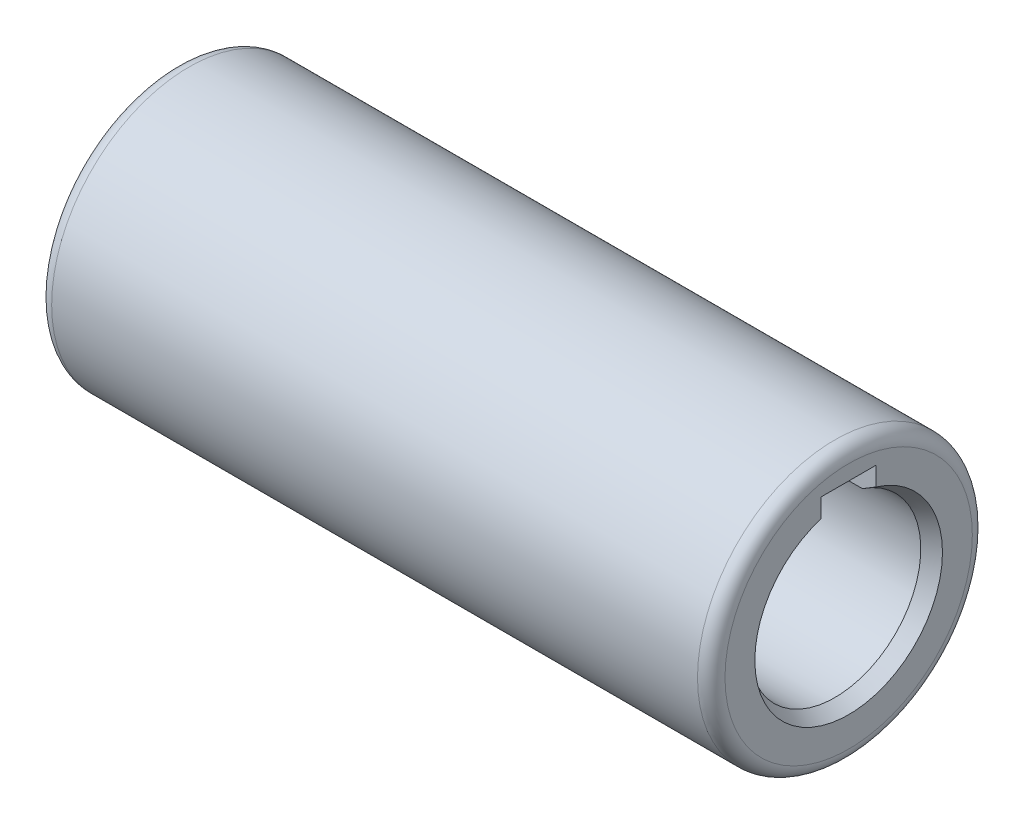
ISO-10303-21;
HEADER;
FILE_DESCRIPTION(('STEP AP214'),'2;1');
FILE_NAME('part.step','',(''),(''),'','','');
FILE_SCHEMA(('AUTOMOTIVE_DESIGN { 1 0 10303 214 1 1 1 1 }'));
ENDSEC;
DATA;
#1=APPLICATION_CONTEXT('core data for automotive mechanical design processes');
#2=APPLICATION_PROTOCOL_DEFINITION('international standard','automotive_design',2000,#1);
#3=PRODUCT_CONTEXT('',#1,'mechanical');
#4=PRODUCT('Part','Part','',(#3));
#5=PRODUCT_RELATED_PRODUCT_CATEGORY('part','',(#4));
#6=PRODUCT_DEFINITION_FORMATION('','',#4);
#7=PRODUCT_DEFINITION_CONTEXT('part definition',#1,'design');
#8=PRODUCT_DEFINITION('design','',#6,#7);
#9=PRODUCT_DEFINITION_SHAPE('','',#8);
#10=(LENGTH_UNIT() NAMED_UNIT(*) SI_UNIT(.MILLI.,.METRE.));
#11=(NAMED_UNIT(*) PLANE_ANGLE_UNIT() SI_UNIT($,.RADIAN.));
#12=(NAMED_UNIT(*) SI_UNIT($,.STERADIAN.) SOLID_ANGLE_UNIT());
#13=UNCERTAINTY_MEASURE_WITH_UNIT(LENGTH_MEASURE(1.E-05),#10,'distance_accuracy_value','');
#14=(GEOMETRIC_REPRESENTATION_CONTEXT(3) GLOBAL_UNCERTAINTY_ASSIGNED_CONTEXT((#13)) GLOBAL_UNIT_ASSIGNED_CONTEXT((#10,
#11,#12)) REPRESENTATION_CONTEXT('',''));
#15=CARTESIAN_POINT('',(0.,0.,0.));
#16=DIRECTION('',(0.,0.,1.));
#17=DIRECTION('',(1.,0.,0.));
#18=AXIS2_PLACEMENT_3D('',#15,#16,#17);
#19=CARTESIAN_POINT('',(-49.,0.,0.));
#20=DIRECTION('',(-1.,0.,0.));
#21=DIRECTION('',(0.,0.,1.));
#22=AXIS2_PLACEMENT_3D('',#19,#20,#21);
#23=CYLINDRICAL_SURFACE('',#22,12.5);
#24=CARTESIAN_POINT('',(15.,0.,0.));
#25=DIRECTION('',(-1.,0.,0.));
#26=DIRECTION('',(0.,0.,1.));
#27=AXIS2_PLACEMENT_3D('',#24,#25,#26);
#28=CIRCLE('',#27,12.5);
#29=CARTESIAN_POINT('',(15.,11.842719282327,-4.));
#30=VERTEX_POINT('',#29);
#31=CARTESIAN_POINT('',(15.,11.842719282327,4.));
#32=VERTEX_POINT('',#31);
#33=EDGE_CURVE('E226',#30,#32,#28,.T.);
#34=ORIENTED_EDGE('',*,*,#33,.T.);
#35=DIRECTION('',(-1.,0.,0.));
#36=VECTOR('',#35,1.);
#37=CARTESIAN_POINT('',(-49.,11.842719282327,4.));
#38=LINE('',#37,#36);
#39=CARTESIAN_POINT('',(47.,11.842719282327,4.));
#40=VERTEX_POINT('',#39);
#41=EDGE_CURVE('E180',#32,#40,#38,.F.);
#42=ORIENTED_EDGE('',*,*,#41,.T.);
#43=CARTESIAN_POINT('',(47.,0.,0.));
#44=DIRECTION('',(-1.,0.,0.));
#45=DIRECTION('',(0.,0.,1.));
#46=AXIS2_PLACEMENT_3D('',#43,#44,#45);
#47=CIRCLE('',#46,12.5);
#48=CARTESIAN_POINT('',(47.,11.842719282327,-4.));
#49=VERTEX_POINT('',#48);
#50=EDGE_CURVE('E247',#40,#49,#47,.F.);
#51=ORIENTED_EDGE('',*,*,#50,.T.);
#52=DIRECTION('',(-1.,0.,0.));
#53=VECTOR('',#52,1.);
#54=CARTESIAN_POINT('',(-49.,11.842719282327,-4.));
#55=LINE('',#54,#53);
#56=EDGE_CURVE('E48',#49,#30,#55,.T.);
#57=ORIENTED_EDGE('',*,*,#56,.T.);
#58=EDGE_LOOP('',(#34,#42,#51,#57));
#59=FACE_BOUND('',#58,.T.);
#60=ADVANCED_FACE('F19',(#59),#23,.F.);
#61=CARTESIAN_POINT('',(9.5,0.,0.));
#62=DIRECTION('',(-1.,0.,0.));
#63=DIRECTION('',(0.,0.,1.));
#64=AXIS2_PLACEMENT_3D('',#61,#62,#63);
#65=CONICAL_SURFACE('',#64,18.,0.785398163397448);
#66=CARTESIAN_POINT('',(8.85572277049937,15.8,-9.89793278470182));
#67=CARTESIAN_POINT('',(8.99703622509578,15.8,-9.6317157320753));
#68=CARTESIAN_POINT('',(9.13519027160307,15.8,-9.36379790013403));
#69=CARTESIAN_POINT('',(9.40432649177142,15.8,-8.82429815049603));
#70=CARTESIAN_POINT('',(9.53530672458058,15.8,-8.55271526575956));
#71=CARTESIAN_POINT('',(9.78962033725127,15.8,-8.0047854361126));
#72=CARTESIAN_POINT('',(9.91292461411103,15.8,-7.7284249006384));
#73=CARTESIAN_POINT('',(10.150313504351,15.8,-7.17182109608536));
#74=CARTESIAN_POINT('',(10.2643987882355,15.8,-6.89157811111982));
#75=CARTESIAN_POINT('',(10.5932711020364,15.8,-6.03935236846723));
#76=CARTESIAN_POINT('',(10.7922351070715,15.8,-5.46103013155887));
#77=CARTESIAN_POINT('',(11.0512688091154,15.8,-4.58246266692018));
#78=CARTESIAN_POINT('',(11.1310101593197,15.8,-4.28793179556967));
#79=CARTESIAN_POINT('',(11.2761517870685,15.8,-3.69536905003883));
#80=CARTESIAN_POINT('',(11.3415538416801,15.8,-3.39733761451162));
#81=CARTESIAN_POINT('',(11.4747437560512,15.8,-2.70503859794777));
#82=CARTESIAN_POINT('',(11.5369443749406,15.8,-2.30967556227056));
#83=CARTESIAN_POINT('',(11.6323884484028,15.8,-1.51542220239535));
#84=CARTESIAN_POINT('',(11.6656303822326,15.8,-1.11653169406588));
#85=CARTESIAN_POINT('',(11.701730775024,15.8,-0.320078234625199));
#86=CARTESIAN_POINT('',(11.7047944091211,15.8,0.0774752848523487));
#87=CARTESIAN_POINT('',(11.6809542959951,15.8,0.871674302868567));
#88=CARTESIAN_POINT('',(11.6540496473695,15.8,1.26831977373485));
#89=CARTESIAN_POINT('',(11.5655810987717,15.8,2.11321854639858));
#90=CARTESIAN_POINT('',(11.4997393189528,15.8,2.56102452146282));
#91=CARTESIAN_POINT('',(11.3335927029724,15.8,3.45017576602934));
#92=CARTESIAN_POINT('',(11.2332813578062,15.8,3.8915197988782));
#93=CARTESIAN_POINT('',(11.0008727480434,15.8,4.77108270233636));
#94=CARTESIAN_POINT('',(10.8684263626972,15.8,5.20920867942985));
#95=CARTESIAN_POINT('',(10.6497251427027,15.8,5.85947625240381));
#96=CARTESIAN_POINT('',(10.5734925666881,15.8,6.07506271076299));
#97=CARTESIAN_POINT('',(10.4148646535092,15.8,6.50396128077886));
#98=CARTESIAN_POINT('',(10.3324691940791,15.8,6.71727334721782));
#99=CARTESIAN_POINT('',(9.98947258947809,15.8,7.57128842357318));
#100=CARTESIAN_POINT('',(9.70584938909531,15.8,8.20282509228455));
#101=CARTESIAN_POINT('',(9.09926289624916,15.8,9.44681788084598));
#102=CARTESIAN_POINT('',(8.77627388345155,15.8,10.0592611940538));
#103=CARTESIAN_POINT('',(8.09913584944159,15.8,11.2696953155097));
#104=CARTESIAN_POINT('',(7.74487020104779,15.8,11.8676204331093));
#105=CARTESIAN_POINT('',(7.01340357492583,15.8,13.0489710184005));
#106=CARTESIAN_POINT('',(6.63620794159584,15.8,13.6323998204965));
#107=CARTESIAN_POINT('',(5.88439338758563,15.8,14.7566798980965));
#108=CARTESIAN_POINT('',(5.51069529596322,15.8,15.2981500358936));
#109=CARTESIAN_POINT('',(4.75048376079012,15.8,16.372058353685));
#110=CARTESIAN_POINT('',(4.36396920682825,15.8,16.9044957450145));
#111=CARTESIAN_POINT('',(3.58424749394091,15.8,17.9568054822315));
#112=CARTESIAN_POINT('',(3.19113555870851,15.8,18.476748546159));
#113=CARTESIAN_POINT('',(2.59529255763809,15.8,19.2517965335333));
#114=CARTESIAN_POINT('',(2.39567387371767,15.8,19.5093035127072));
#115=CARTESIAN_POINT('',(1.99454553499249,15.8,20.0228339389943));
#116=CARTESIAN_POINT('',(1.79303591132327,15.8,20.2788574104227));
#117=CARTESIAN_POINT('',(1.59066883004635,15.8,20.5342017540087));
#118=B_SPLINE_CURVE_WITH_KNOTS('',3,(#66,#67,#68,#69,#70,#71,#72,#73,#74,#75,#76,#77,#78,#79,
#80,#81,#82,#83,#84,#85,#86,#87,#88,#89,#90,#91,#92,#93,#94,#95,#96,#97,#98,#99,#100,#101,#102,
#103,#104,#105,#106,#107,#108,#109,#110,#111,#112,#113,#114,#115,#116,#117),.UNSPECIFIED.,.F.,
.F.,(4,2,2,2,2,2,2,2,2,2,2,2,2,2,2,2,2,2,2,2,2,2,2,2,2,4),(0.,0.904202866942644,
1.80864916674681,2.7163385013326,3.62396175945611,5.45629054214186,6.37140457464115,
7.28640513298101,8.48605386311908,9.68576558808473,10.8773150801778,12.0689004133236,
13.4252429315917,14.781841713489,16.1538964196934,16.8398213809633,17.525759953938,
19.6005987453654,21.6768005099047,23.7611006075319,25.8449167564982,27.8184103633895,
29.7920754017303,31.747448990472,32.7248963253095,33.7023275939827),.UNSPECIFIED.);
#119=CARTESIAN_POINT('',(11.2015338144965,15.8,-4.));
#120=VERTEX_POINT('',#119);
#121=CARTESIAN_POINT('',(11.2015338144965,15.8,4.));
#122=VERTEX_POINT('',#121);
#123=EDGE_CURVE('E210',#120,#122,#118,.T.);
#124=ORIENTED_EDGE('',*,*,#123,.T.);
#125=CARTESIAN_POINT('',(2.13337571193034,25.0492640165752,4.));
#126=CARTESIAN_POINT('',(2.53317013683548,24.6444027376879,4.));
#127=CARTESIAN_POINT('',(2.93284443989062,24.2394228599279,4.));
#128=CARTESIAN_POINT('',(3.73190954817092,23.4291832350131,4.));
#129=CARTESIAN_POINT('',(4.13130035329264,23.0239234877563,4.));
#130=CARTESIAN_POINT('',(5.32894046462713,21.8077032633964,4.));
#131=CARTESIAN_POINT('',(6.12669927381731,20.9962594849261,4.));
#132=CARTESIAN_POINT('',(7.72016134653793,19.3718081031742,4.));
#133=CARTESIAN_POINT('',(8.51586512978022,18.5588010098217,4.));
#134=CARTESIAN_POINT('',(10.104664259481,16.9301533573577,4.));
#135=CARTESIAN_POINT('',(10.8977594638093,16.1145126593979,4.));
#136=CARTESIAN_POINT('',(12.0844995151109,14.8878542567455,4.));
#137=CARTESIAN_POINT('',(12.4796922781226,14.4783344301535,4.));
#138=CARTESIAN_POINT('',(13.2687411707689,13.6580147589976,4.));
#139=CARTESIAN_POINT('',(13.6625973112943,13.2472149249158,4.));
#140=CARTESIAN_POINT('',(14.4485218014361,12.4240124584381,4.));
#141=CARTESIAN_POINT('',(14.8405903829018,12.0116100475392,4.));
#142=CARTESIAN_POINT('',(15.6224183400781,11.1845952658113,4.));
#143=CARTESIAN_POINT('',(16.0121776448367,10.7699828278156,4.));
#144=CARTESIAN_POINT('',(16.7886711007095,9.93755967342551,4.));
#145=CARTESIAN_POINT('',(17.1754037112287,9.5197475184383,4.));
#146=CARTESIAN_POINT('',(17.9442430903997,8.67993498570472,4.));
#147=CARTESIAN_POINT('',(18.3263502461035,8.25793496384719,4.));
#148=CARTESIAN_POINT('',(18.8943427370386,7.6201424811189,4.));
#149=CARTESIAN_POINT('',(19.0828576893291,7.4066934283566,4.));
#150=CARTESIAN_POINT('',(19.4576469177606,6.97784648762662,4.));
#151=CARTESIAN_POINT('',(19.6439212655432,6.76244866235741,4.));
#152=CARTESIAN_POINT('',(20.0136622228072,6.32914193729564,4.));
#153=CARTESIAN_POINT('',(20.1971280130418,6.11123233613756,4.));
#154=CARTESIAN_POINT('',(20.4695038525965,5.78201215080438,4.));
#155=CARTESIAN_POINT('',(20.5598302214949,5.67187332801279,4.));
#156=CARTESIAN_POINT('',(20.7393820931848,5.45069756175215,4.));
#157=CARTESIAN_POINT('',(20.8286075668225,5.33966059462685,4.));
#158=CARTESIAN_POINT('',(20.9172020118082,5.22811910282673,4.));
#159=B_SPLINE_CURVE_WITH_KNOTS('',3,(#125,#126,#127,#128,#129,#130,#131,#132,#133,#134,#135,
#136,#137,#138,#139,#140,#141,#142,#143,#144,#145,#146,#147,#148,#149,#150,#151,#152,#153,#154,
#155,#156,#157,#158),.UNSPECIFIED.,.F.,.F.,(4,2,2,2,2,2,2,2,2,2,2,2,2,2,2,2,4),(0.,
1.70696627873841,3.41393317994291,6.82768852146996,10.2404737579677,13.6534419603905,
15.3607634804011,17.0680710555115,18.7751505036449,20.4822821322046,22.1902325413504,
23.8980390294358,24.7523604725004,25.6066545262674,26.4611932003954,26.8885096061302,
27.3158373038568),.UNSPECIFIED.);
#160=EDGE_CURVE('E266',#122,#32,#159,.T.);
#161=ORIENTED_EDGE('',*,*,#160,.T.);
#162=ORIENTED_EDGE('',*,*,#33,.F.);
#163=CARTESIAN_POINT('',(20.9172020118082,5.22811910282673,-4.));
#164=CARTESIAN_POINT('',(20.8170325619326,5.35422946879821,-4.));
#165=CARTESIAN_POINT('',(20.7160598339515,5.47969674883904,-4.));
#166=CARTESIAN_POINT('',(20.5127340229987,5.72950119899705,-4.));
#167=CARTESIAN_POINT('',(20.41038098825,5.85383840834231,-4.));
#168=CARTESIAN_POINT('',(20.1016079494174,6.22536864691434,-4.));
#169=CARTESIAN_POINT('',(19.8934468239349,6.47111427578518,-4.));
#170=CARTESIAN_POINT('',(19.473778313134,6.95958376804249,-4.));
#171=CARTESIAN_POINT('',(19.2622720164483,7.20230857035912,-4.));
#172=CARTESIAN_POINT('',(18.8366564057803,7.68547905882638,-4.));
#173=CARTESIAN_POINT('',(18.6225469891727,7.92592465445226,-4.));
#174=CARTESIAN_POINT('',(18.1924219900672,8.40488528363579,-4.));
#175=CARTESIAN_POINT('',(17.976407413128,8.6434012215248,-4.));
#176=CARTESIAN_POINT('',(17.5427840612199,9.11897195365509,-4.));
#177=CARTESIAN_POINT('',(17.3251753083221,9.35602676804212,-4.));
#178=CARTESIAN_POINT('',(16.670397290232,10.0654682672915,-4.));
#179=CARTESIAN_POINT('',(16.2313150670149,10.5360890470687,-4.));
#180=CARTESIAN_POINT('',(15.4517230875281,11.3655593205407,-4.));
#181=CARTESIAN_POINT('',(15.1119161197434,11.7250714518025,-4.));
#182=CARTESIAN_POINT('',(14.4307445194206,12.442595529905,-4.));
#183=CARTESIAN_POINT('',(14.0893799363001,12.8006075236579,-4.));
#184=CARTESIAN_POINT('',(13.4053667955202,13.5155274004043,-4.));
#185=CARTESIAN_POINT('',(13.0627180143459,13.8724350693779,-4.));
#186=CARTESIAN_POINT('',(12.3764397012333,14.5853124972154,-4.));
#187=CARTESIAN_POINT('',(12.0328101599346,14.941282247065,-4.));
#188=CARTESIAN_POINT('',(10.8974866083827,16.1147947817866,-4.));
#189=CARTESIAN_POINT('',(10.1041169928942,16.9307162572678,-4.));
#190=CARTESIAN_POINT('',(8.51472524958443,18.559967587721,-4.));
#191=CARTESIAN_POINT('',(7.71870312220161,19.3732974431212,-4.));
#192=CARTESIAN_POINT('',(6.1251941631407,20.9977911063957,-4.));
#193=CARTESIAN_POINT('',(5.32770816750057,21.8089557345628,-4.));
#194=CARTESIAN_POINT('',(4.1305009586422,23.0247347592786,-4.));
#195=CARTESIAN_POINT('',(3.73126986588887,23.4298320894312,-4.));
#196=CARTESIAN_POINT('',(2.93252442850422,24.2397471201106,-4.));
#197=CARTESIAN_POINT('',(2.53301008397723,24.6445648207403,-4.));
#198=CARTESIAN_POINT('',(2.13337571193033,25.0492640165752,-4.));
#199=B_SPLINE_CURVE_WITH_KNOTS('',3,(#163,#164,#165,#166,#167,#168,#169,#170,#171,#172,#173,
#174,#175,#176,#177,#178,#179,#180,#181,#182,#183,#184,#185,#186,#187,#188,#189,#190,#191,#192,
#193,#194,#195,#196,#197,#198),.UNSPECIFIED.,.F.,.F.,(4,2,2,2,2,2,2,2,2,2,2,2,2,2,2,2,2,4),(0.,
0.483146689108818,0.966276542226838,1.93240569909265,2.89822666268214,3.86408582702464,
4.82946254080824,5.79482591421442,7.72572631931994,9.20979093963189,10.693808798613,
12.1780982065834,13.6624018283962,17.07654768025,20.4906929679053,23.9032773376349,
25.6095608761451,27.3158437865986),.UNSPECIFIED.);
#200=EDGE_CURVE('E137',#30,#120,#199,.T.);
#201=ORIENTED_EDGE('',*,*,#200,.T.);
#202=EDGE_LOOP('',(#124,#161,#162,#201));
#203=FACE_BOUND('',#202,.T.);
#204=CARTESIAN_POINT('',(9.5,0.,0.));
#205=DIRECTION('',(-1.,0.,0.));
#206=DIRECTION('',(0.,0.,1.));
#207=AXIS2_PLACEMENT_3D('',#204,#205,#206);
#208=CIRCLE('',#207,18.);
#209=CARTESIAN_POINT('',(9.5,0.,18.));
#210=VERTEX_POINT('',#209);
#211=EDGE_CURVE('E223',#210,#210,#208,.T.);
#212=ORIENTED_EDGE('',*,*,#211,.T.);
#213=EDGE_LOOP('',(#212));
#214=FACE_BOUND('',#213,.T.);
#215=ADVANCED_FACE('F152',(#203,#214),#65,.F.);
#216=CARTESIAN_POINT('',(-49.,0.,0.));
#217=DIRECTION('',(-1.,0.,0.));
#218=DIRECTION('',(0.,0.,1.));
#219=AXIS2_PLACEMENT_3D('',#216,#217,#218);
#220=CYLINDRICAL_SURFACE('',#219,18.);
#221=ORIENTED_EDGE('',*,*,#211,.F.);
#222=EDGE_LOOP('',(#221));
#223=FACE_BOUND('',#222,.T.);
#224=CARTESIAN_POINT('',(-9.5,0.,0.));
#225=DIRECTION('',(-1.,0.,0.));
#226=DIRECTION('',(0.,0.,1.));
#227=AXIS2_PLACEMENT_3D('',#224,#225,#226);
#228=CIRCLE('',#227,18.);
#229=CARTESIAN_POINT('',(-9.5,0.,18.));
#230=VERTEX_POINT('',#229);
#231=EDGE_CURVE('E220',#230,#230,#228,.T.);
#232=ORIENTED_EDGE('',*,*,#231,.T.);
#233=EDGE_LOOP('',(#232));
#234=FACE_BOUND('',#233,.T.);
#235=ADVANCED_FACE('F188',(#223,#234),#220,.F.);
#236=CARTESIAN_POINT('',(-15.,0.,0.));
#237=DIRECTION('',(1.,0.,0.));
#238=DIRECTION('',(0.,0.,-1.));
#239=AXIS2_PLACEMENT_3D('',#236,#237,#238);
#240=CONICAL_SURFACE('',#239,12.5,0.785398163397448);
#241=ORIENTED_EDGE('',*,*,#231,.F.);
#242=EDGE_LOOP('',(#241));
#243=FACE_BOUND('',#242,.T.);
#244=CARTESIAN_POINT('',(-15.,0.,0.));
#245=DIRECTION('',(-1.,0.,0.));
#246=DIRECTION('',(0.,0.,1.));
#247=AXIS2_PLACEMENT_3D('',#244,#245,#246);
#248=CIRCLE('',#247,12.5);
#249=CARTESIAN_POINT('',(-15.,11.842719282327,-4.));
#250=VERTEX_POINT('',#249);
#251=CARTESIAN_POINT('',(-15.,11.842719282327,4.));
#252=VERTEX_POINT('',#251);
#253=EDGE_CURVE('E217',#250,#252,#248,.T.);
#254=ORIENTED_EDGE('',*,*,#253,.T.);
#255=CARTESIAN_POINT('',(-21.2980953341202,4.73958030680576,4.));
#256=CARTESIAN_POINT('',(-21.2058737832259,4.86023581476298,4.));
#257=CARTESIAN_POINT('',(-21.112749311515,4.9801955420306,4.));
#258=CARTESIAN_POINT('',(-20.9249490930037,5.21888591904653,4.));
#259=CARTESIAN_POINT('',(-20.830273421676,5.33761662813608,4.));
#260=CARTESIAN_POINT('',(-20.6396337715719,5.5740015545468,4.));
#261=CARTESIAN_POINT('',(-20.54367003106,5.69165596436934,4.));
#262=CARTESIAN_POINT('',(-20.3506230910242,5.92604460527365,4.));
#263=CARTESIAN_POINT('',(-20.2535398759074,6.04277882350003,4.));
#264=CARTESIAN_POINT('',(-19.9609408297581,6.39167474951453,4.));
#265=CARTESIAN_POINT('',(-19.7639909350355,6.62263412133092,4.));
#266=CARTESIAN_POINT('',(-19.3672035792014,7.08207264542464,4.));
#267=CARTESIAN_POINT('',(-19.1673659608434,7.31055166144269,4.));
#268=CARTESIAN_POINT('',(-18.7655903876416,7.7653887408632,4.));
#269=CARTESIAN_POINT('',(-18.5636538833075,7.99174808701678,4.));
#270=CARTESIAN_POINT('',(-18.1580261744466,8.44287937793782,4.));
#271=CARTESIAN_POINT('',(-17.9543350029494,8.66765135244144,4.));
#272=CARTESIAN_POINT('',(-17.5455183758068,9.115928665345,4.));
#273=CARTESIAN_POINT('',(-17.3403927739826,9.33943387032295,4.));
#274=CARTESIAN_POINT('',(-16.9289885512028,9.78538117821248,4.));
#275=CARTESIAN_POINT('',(-16.7227099267608,10.0078232779056,4.));
#276=CARTESIAN_POINT('',(-16.3807678162158,10.3749752758605,4.));
#277=CARTESIAN_POINT('',(-16.2453770240626,10.5199393549551,4.));
#278=CARTESIAN_POINT('',(-15.9742362484227,10.809524291748,4.));
#279=CARTESIAN_POINT('',(-15.8384862741214,10.954145158047,4.));
#280=CARTESIAN_POINT('',(-15.4307197622846,11.3875869600869,4.));
#281=CARTESIAN_POINT('',(-15.1582189998689,11.6759523876571,4.));
#282=CARTESIAN_POINT('',(-14.4935856855249,12.3767522744449,4.));
#283=CARTESIAN_POINT('',(-14.1009060872995,12.7886676666746,4.));
#284=CARTESIAN_POINT('',(-13.3139429085549,13.6109640716916,4.));
#285=CARTESIAN_POINT('',(-12.9196593238102,14.0213450804313,4.));
#286=CARTESIAN_POINT('',(-11.7349647802744,15.2507274648373,4.));
#287=CARTESIAN_POINT('',(-10.942718296527,16.0679595194479,4.));
#288=CARTESIAN_POINT('',(-9.35563810248219,17.6989483801785,4.));
#289=CARTESIAN_POINT('',(-8.56080622912546,18.512706976818,4.));
#290=CARTESIAN_POINT('',(-7.36701054186752,19.7318013054526,4.));
#291=CARTESIAN_POINT('',(-6.96882743925046,20.137901939768,4.));
#292=CARTESIAN_POINT('',(-6.17202093519477,20.9496700840375,4.));
#293=CARTESIAN_POINT('',(-5.77339753429197,21.3553375945176,4.));
#294=CARTESIAN_POINT('',(-5.37459356417963,21.7608274187872,4.));
#295=B_SPLINE_CURVE_WITH_KNOTS('',3,(#255,#256,#257,#258,#259,#260,#261,#262,#263,#264,#265,
#266,#267,#268,#269,#270,#271,#272,#273,#274,#275,#276,#277,#278,#279,#280,#281,#282,#283,#284,
#285,#286,#287,#288,#289,#290,#291,#292,#293,#294),.UNSPECIFIED.,.F.,.F.,(4,2,2,2,2,2,2,2,2,2,2,
2,2,2,2,2,2,2,2,4),(0.,0.455580141054272,0.911138181554282,1.36661308444265,1.82209433923944,
2.73265367879277,3.64326278967333,4.55327967295811,5.46327946348328,6.37337338170259,
7.28347005340319,7.87853857858266,8.4735920306621,9.66384130881182,11.3711266778473,
13.0784165474651,16.4930322395651,19.9055997453083,21.6118255695646,23.3180493196699),.UNSPECIFIED.);
#296=CARTESIAN_POINT('',(-11.2015338144965,15.8,4.));
#297=VERTEX_POINT('',#296);
#298=EDGE_CURVE('E195',#252,#297,#295,.T.);
#299=ORIENTED_EDGE('',*,*,#298,.T.);
#300=CARTESIAN_POINT('',(-8.85572277049938,15.8,-9.89793278470182));
#301=CARTESIAN_POINT('',(-8.99703622509579,15.8,-9.6317157320753));
#302=CARTESIAN_POINT('',(-9.13519027160307,15.8,-9.36379790013403));
#303=CARTESIAN_POINT('',(-9.40432649177143,15.8,-8.82429815049603));
#304=CARTESIAN_POINT('',(-9.53530672458059,15.8,-8.55271526575955));
#305=CARTESIAN_POINT('',(-9.78962033725127,15.8,-8.0047854361126));
#306=CARTESIAN_POINT('',(-9.91292461411104,15.8,-7.7284249006384));
#307=CARTESIAN_POINT('',(-10.150313504351,15.8,-7.17182109608536));
#308=CARTESIAN_POINT('',(-10.2643987882355,15.8,-6.89157811111982));
#309=CARTESIAN_POINT('',(-10.5932711020364,15.8,-6.03935236846723));
#310=CARTESIAN_POINT('',(-10.7922351070715,15.8,-5.46103013155887));
#311=CARTESIAN_POINT('',(-11.0512688091154,15.8,-4.58246266692019));
#312=CARTESIAN_POINT('',(-11.1310101593197,15.8,-4.28793179556968));
#313=CARTESIAN_POINT('',(-11.2761517870685,15.8,-3.69536905003883));
#314=CARTESIAN_POINT('',(-11.3415538416801,15.8,-3.39733761451162));
#315=CARTESIAN_POINT('',(-11.4747437560512,15.8,-2.70503859794777));
#316=CARTESIAN_POINT('',(-11.5369443749406,15.8,-2.30967556227055));
#317=CARTESIAN_POINT('',(-11.6323884484028,15.8,-1.51542220239535));
#318=CARTESIAN_POINT('',(-11.6656303822326,15.8,-1.11653169406588));
#319=CARTESIAN_POINT('',(-11.701730775024,15.8,-0.320078234625198));
#320=CARTESIAN_POINT('',(-11.7047944091211,15.8,0.0774752848523491));
#321=CARTESIAN_POINT('',(-11.6809542959951,15.8,0.871674302868566));
#322=CARTESIAN_POINT('',(-11.6540496473695,15.8,1.26831977373485));
#323=CARTESIAN_POINT('',(-11.5655810987717,15.8,2.11321854639858));
#324=CARTESIAN_POINT('',(-11.4997393189528,15.8,2.56102452146282));
#325=CARTESIAN_POINT('',(-11.3335927029724,15.8,3.45017576602934));
#326=CARTESIAN_POINT('',(-11.2332813578062,15.8,3.8915197988782));
#327=CARTESIAN_POINT('',(-11.0008727480434,15.8,4.77108270233636));
#328=CARTESIAN_POINT('',(-10.8684263626972,15.8,5.20920867942985));
#329=CARTESIAN_POINT('',(-10.6497251427027,15.8,5.85947625240381));
#330=CARTESIAN_POINT('',(-10.5734925666881,15.8,6.07506271076299));
#331=CARTESIAN_POINT('',(-10.4148646535092,15.8,6.50396128077886));
#332=CARTESIAN_POINT('',(-10.3324691940791,15.8,6.71727334721782));
#333=CARTESIAN_POINT('',(-9.98947258947808,15.8,7.57128842357318));
#334=CARTESIAN_POINT('',(-9.70584938909531,15.8,8.20282509228456));
#335=CARTESIAN_POINT('',(-9.09926289624917,15.8,9.44681788084598));
#336=CARTESIAN_POINT('',(-8.77627388345155,15.8,10.0592611940538));
#337=CARTESIAN_POINT('',(-8.0991358494416,15.8,11.2696953155097));
#338=CARTESIAN_POINT('',(-7.7448702010478,15.8,11.8676204331092));
#339=CARTESIAN_POINT('',(-7.01340357492584,15.8,13.0489710184005));
#340=CARTESIAN_POINT('',(-6.63620794159586,15.8,13.6323998204965));
#341=CARTESIAN_POINT('',(-5.88439338758564,15.8,14.7566798980964));
#342=CARTESIAN_POINT('',(-5.51069529596324,15.8,15.2981500358936));
#343=CARTESIAN_POINT('',(-4.75048376079014,15.8,16.372058353685));
#344=CARTESIAN_POINT('',(-4.36396920682827,15.8,16.9044957450144));
#345=CARTESIAN_POINT('',(-3.58424749394093,15.8,17.9568054822315));
#346=CARTESIAN_POINT('',(-3.19113555870853,15.8,18.4767485461589));
#347=CARTESIAN_POINT('',(-2.59529255763811,15.8,19.2517965335333));
#348=CARTESIAN_POINT('',(-2.39567387371771,15.8,19.5093035127071));
#349=CARTESIAN_POINT('',(-1.99454553499252,15.8,20.0228339389943));
#350=CARTESIAN_POINT('',(-1.7930359113233,15.8,20.2788574104226));
#351=CARTESIAN_POINT('',(-1.59066883004637,15.8,20.5342017540086));
#352=B_SPLINE_CURVE_WITH_KNOTS('',3,(#300,#301,#302,#303,#304,#305,#306,#307,#308,#309,#310,
#311,#312,#313,#314,#315,#316,#317,#318,#319,#320,#321,#322,#323,#324,#325,#326,#327,#328,#329,
#330,#331,#332,#333,#334,#335,#336,#337,#338,#339,#340,#341,#342,#343,#344,#345,#346,#347,#348,
#349,#350,#351),.UNSPECIFIED.,.F.,.F.,(4,2,2,2,2,2,2,2,2,2,2,2,2,2,2,2,2,2,2,2,2,2,2,2,2,4),(0.,
0.904202866942643,1.80864916674681,2.7163385013326,3.62396175945611,5.45629054214185,
6.37140457464115,7.28640513298101,8.48605386311908,9.68576558808473,10.8773150801778,
12.0689004133236,13.4252429315917,14.7818417134889,16.1538964196934,16.8398213809633,
17.525759953938,19.6005987453654,21.6768005099047,23.7611006075319,25.8449167564982,
27.8184103633895,29.7920754017303,31.747448990472,32.7248963253094,33.7023275939827),.UNSPECIFIED.);
#353=CARTESIAN_POINT('',(-11.2015338144965,15.8,-4.));
#354=VERTEX_POINT('',#353);
#355=EDGE_CURVE('E202',#297,#354,#352,.F.);
#356=ORIENTED_EDGE('',*,*,#355,.T.);
#357=CARTESIAN_POINT('',(-5.37459356417963,21.7608274187872,-4.));
#358=CARTESIAN_POINT('',(-5.77365761889642,21.3550731457813,-4.));
#359=CARTESIAN_POINT('',(-6.17254087180182,20.9491409571615,-4.));
#360=CARTESIAN_POINT('',(-6.96986629859425,20.1368429970911,-4.));
#361=CARTESIAN_POINT('',(-7.36830847211476,19.7304772252807,-4.));
#362=CARTESIAN_POINT('',(-8.5628064593018,18.5106616158048,-4.));
#363=CARTESIAN_POINT('',(-9.35808056918769,17.6964459066044,-4.));
#364=CARTESIAN_POINT('',(-10.9450820527526,16.065522690745,-4.));
#365=CARTESIAN_POINT('',(-11.736811287154,15.2488169977791,-4.));
#366=CARTESIAN_POINT('',(-12.920766769511,14.0201930426746,-4.));
#367=CARTESIAN_POINT('',(-13.3148266901841,13.6100422728629,-4.));
#368=CARTESIAN_POINT('',(-14.101345962227,12.788206364915,-4.));
#369=CARTESIAN_POINT('',(-14.4938053114048,12.3765212246789,-4.));
#370=CARTESIAN_POINT('',(-15.1621887665241,11.6717662297379,-4.));
#371=CARTESIAN_POINT('',(-15.4386438569133,11.3792000986057,-4.));
#372=CARTESIAN_POINT('',(-15.9902214857881,10.7928180556474,-4.));
#373=CARTESIAN_POINT('',(-16.2653440353729,10.4990021542696,-4.));
#374=CARTESIAN_POINT('',(-16.8138578569624,9.90985351366744,-4.));
#375=CARTESIAN_POINT('',(-17.0872494237704,9.61452104914077,-4.));
#376=CARTESIAN_POINT('',(-17.6318674624968,9.0218471559714,-4.));
#377=CARTESIAN_POINT('',(-17.9030938688997,8.72450566703654,-4.));
#378=CARTESIAN_POINT('',(-18.4428387893043,8.12702923080101,-4.));
#379=CARTESIAN_POINT('',(-18.7113554770167,7.82689263159812,-4.));
#380=CARTESIAN_POINT('',(-19.244452257082,7.22317348058009,-4.));
#381=CARTESIAN_POINT('',(-19.5090326761748,6.91959121851039,-4.));
#382=CARTESIAN_POINT('',(-19.9018060887975,6.46055517203696,-4.));
#383=CARTESIAN_POINT('',(-20.0320854149468,6.30688696590914,-4.));
#384=CARTESIAN_POINT('',(-20.2909443247858,5.9981305481918,-4.));
#385=CARTESIAN_POINT('',(-20.4195239520231,5.84304237315597,-4.));
#386=CARTESIAN_POINT('',(-20.6746566901656,5.5311306533607,-4.));
#387=CARTESIAN_POINT('',(-20.8012092244398,5.37430663554339,-4.));
#388=CARTESIAN_POINT('',(-21.0517283437562,5.05858608776104,-4.));
#389=CARTESIAN_POINT('',(-21.1756946979741,4.8996893748413,-4.));
#390=CARTESIAN_POINT('',(-21.2980953341202,4.73958030680577,-4.));
#391=B_SPLINE_CURVE_WITH_KNOTS('',3,(#357,#358,#359,#360,#361,#362,#363,#364,#365,#366,#367,
#368,#369,#370,#371,#372,#373,#374,#375,#376,#377,#378,#379,#380,#381,#382,#383,#384,#385,#386,
#387,#388,#389,#390),.UNSPECIFIED.,.F.,.F.,(4,2,2,2,2,2,2,2,2,2,2,2,2,2,2,2,4),(0.,
1.70733649248926,3.41467440259294,6.82914994940208,10.2415517566828,11.9478787173843,
13.6542080141699,14.8617648793267,16.0693116688782,17.2766469491288,18.4840186246953,
19.6921559576785,20.9001924403009,21.504566398555,22.1089248421508,22.7134522543594,
23.318033393613),.UNSPECIFIED.);
#392=EDGE_CURVE('E103',#354,#250,#391,.T.);
#393=ORIENTED_EDGE('',*,*,#392,.T.);
#394=EDGE_LOOP('',(#254,#299,#356,#393));
#395=FACE_BOUND('',#394,.T.);
#396=ADVANCED_FACE('F183',(#243,#395),#240,.F.);
#397=CARTESIAN_POINT('',(-49.,0.,0.));
#398=DIRECTION('',(-1.,0.,0.));
#399=DIRECTION('',(0.,0.,1.));
#400=AXIS2_PLACEMENT_3D('',#397,#398,#399);
#401=CYLINDRICAL_SURFACE('',#400,12.5);
#402=CARTESIAN_POINT('',(-47.,0.,0.));
#403=DIRECTION('',(1.,0.,0.));
#404=DIRECTION('',(0.,0.,-1.));
#405=AXIS2_PLACEMENT_3D('',#402,#403,#404);
#406=CIRCLE('',#405,12.5);
#407=CARTESIAN_POINT('',(-47.,11.842719282327,-4.));
#408=VERTEX_POINT('',#407);
#409=CARTESIAN_POINT('',(-47.,11.842719282327,4.));
#410=VERTEX_POINT('',#409);
#411=EDGE_CURVE('E241',#408,#410,#406,.F.);
#412=ORIENTED_EDGE('',*,*,#411,.T.);
#413=DIRECTION('',(-1.,0.,0.));
#414=VECTOR('',#413,1.);
#415=CARTESIAN_POINT('',(-49.,11.842719282327,4.));
#416=LINE('',#415,#414);
#417=EDGE_CURVE('E203',#410,#252,#416,.F.);
#418=ORIENTED_EDGE('',*,*,#417,.T.);
#419=ORIENTED_EDGE('',*,*,#253,.F.);
#420=DIRECTION('',(-1.,0.,0.));
#421=VECTOR('',#420,1.);
#422=CARTESIAN_POINT('',(-49.,11.842719282327,-4.));
#423=LINE('',#422,#421);
#424=EDGE_CURVE('E181',#250,#408,#423,.T.);
#425=ORIENTED_EDGE('',*,*,#424,.T.);
#426=EDGE_LOOP('',(#412,#418,#419,#425));
#427=FACE_BOUND('',#426,.T.);
#428=ADVANCED_FACE('F187',(#427),#401,.F.);
#429=CARTESIAN_POINT('',(-49.,12.5,0.));
#430=DIRECTION('',(1.,0.,0.));
#431=DIRECTION('',(0.,0.,-1.));
#432=AXIS2_PLACEMENT_3D('',#429,#430,#431);
#433=PLANE('',#432);
#434=DIRECTION('',(0.,0.,1.));
#435=VECTOR('',#434,1.);
#436=CARTESIAN_POINT('',(-49.,15.8,4.));
#437=LINE('',#436,#435);
#438=CARTESIAN_POINT('',(-49.,15.8,-4.));
#439=VERTEX_POINT('',#438);
#440=CARTESIAN_POINT('',(-49.,15.8,4.));
#441=VERTEX_POINT('',#440);
#442=EDGE_CURVE('E110',#439,#441,#437,.T.);
#443=ORIENTED_EDGE('',*,*,#442,.T.);
#444=DIRECTION('',(0.,-1.,0.));
#445=VECTOR('',#444,1.);
#446=CARTESIAN_POINT('',(-49.,10.7980422665428,4.));
#447=LINE('',#446,#445);
#448=CARTESIAN_POINT('',(-49.,13.0556825479488,4.));
#449=VERTEX_POINT('',#448);
#450=EDGE_CURVE('E123',#441,#449,#447,.T.);
#451=ORIENTED_EDGE('',*,*,#450,.T.);
#452=CARTESIAN_POINT('',(-49.,0.,0.));
#453=DIRECTION('',(1.,0.,0.));
#454=DIRECTION('',(0.,0.,-1.));
#455=AXIS2_PLACEMENT_3D('',#452,#453,#454);
#456=CIRCLE('',#455,13.6547005383792);
#457=CARTESIAN_POINT('',(-49.,13.0556825479488,-4.));
#458=VERTEX_POINT('',#457);
#459=EDGE_CURVE('E122',#449,#458,#456,.T.);
#460=ORIENTED_EDGE('',*,*,#459,.T.);
#461=DIRECTION('',(0.,1.,0.));
#462=VECTOR('',#461,1.);
#463=CARTESIAN_POINT('',(-49.,10.7980422665428,-4.));
#464=LINE('',#463,#462);
#465=EDGE_CURVE('E40',#458,#439,#464,.T.);
#466=ORIENTED_EDGE('',*,*,#465,.T.);
#467=EDGE_LOOP('',(#443,#451,#460,#466));
#468=FACE_BOUND('',#467,.T.);
#469=CARTESIAN_POINT('',(-49.,0.,0.));
#470=DIRECTION('',(1.,0.,0.));
#471=DIRECTION('',(0.,0.,-1.));
#472=AXIS2_PLACEMENT_3D('',#469,#470,#471);
#473=CIRCLE('',#472,18.);
#474=CARTESIAN_POINT('',(-49.,0.,-18.));
#475=VERTEX_POINT('',#474);
#476=EDGE_CURVE('E238',#475,#475,#473,.F.);
#477=ORIENTED_EDGE('',*,*,#476,.T.);
#478=EDGE_LOOP('',(#477));
#479=FACE_BOUND('',#478,.T.);
#480=ADVANCED_FACE('F119',(#468,#479),#433,.F.);
#481=CARTESIAN_POINT('',(-49.,0.,0.));
#482=DIRECTION('',(-1.,0.,0.));
#483=DIRECTION('',(0.,0.,1.));
#484=AXIS2_PLACEMENT_3D('',#481,#482,#483);
#485=CYLINDRICAL_SURFACE('',#484,20.);
#486=CARTESIAN_POINT('',(47.,0.,0.));
#487=DIRECTION('',(-1.,0.,0.));
#488=DIRECTION('',(0.,0.,1.));
#489=AXIS2_PLACEMENT_3D('',#486,#487,#488);
#490=CIRCLE('',#489,20.);
#491=CARTESIAN_POINT('',(47.,0.,20.));
#492=VERTEX_POINT('',#491);
#493=EDGE_CURVE('E232',#492,#492,#490,.T.);
#494=ORIENTED_EDGE('',*,*,#493,.T.);
#495=EDGE_LOOP('',(#494));
#496=FACE_BOUND('',#495,.T.);
#497=CARTESIAN_POINT('',(-47.,0.,0.));
#498=DIRECTION('',(1.,0.,0.));
#499=DIRECTION('',(0.,0.,-1.));
#500=AXIS2_PLACEMENT_3D('',#497,#498,#499);
#501=CIRCLE('',#500,20.);
#502=CARTESIAN_POINT('',(-47.,0.,-20.));
#503=VERTEX_POINT('',#502);
#504=EDGE_CURVE('E229',#503,#503,#501,.T.);
#505=ORIENTED_EDGE('',*,*,#504,.T.);
#506=EDGE_LOOP('',(#505));
#507=FACE_BOUND('',#506,.T.);
#508=ADVANCED_FACE('F346',(#496,#507),#485,.T.);
#509=CARTESIAN_POINT('',(49.,20.,0.));
#510=DIRECTION('',(-1.,0.,0.));
#511=DIRECTION('',(0.,0.,1.));
#512=AXIS2_PLACEMENT_3D('',#509,#510,#511);
#513=PLANE('',#512);
#514=CARTESIAN_POINT('',(49.,0.,0.));
#515=DIRECTION('',(-1.,0.,0.));
#516=DIRECTION('',(0.,0.,1.));
#517=AXIS2_PLACEMENT_3D('',#514,#515,#516);
#518=CIRCLE('',#517,13.6547005383793);
#519=CARTESIAN_POINT('',(49.,13.0556825479488,-4.));
#520=VERTEX_POINT('',#519);
#521=CARTESIAN_POINT('',(49.,13.0556825479488,4.));
#522=VERTEX_POINT('',#521);
#523=EDGE_CURVE('E245',#520,#522,#518,.T.);
#524=ORIENTED_EDGE('',*,*,#523,.T.);
#525=DIRECTION('',(0.,-1.,0.));
#526=VECTOR('',#525,1.);
#527=CARTESIAN_POINT('',(49.,10.7980422665429,4.));
#528=LINE('',#527,#526);
#529=CARTESIAN_POINT('',(49.,15.8,4.));
#530=VERTEX_POINT('',#529);
#531=EDGE_CURVE('E128',#530,#522,#528,.T.);
#532=ORIENTED_EDGE('',*,*,#531,.F.);
#533=DIRECTION('',(0.,0.,1.));
#534=VECTOR('',#533,1.);
#535=CARTESIAN_POINT('',(49.,15.8,4.));
#536=LINE('',#535,#534);
#537=CARTESIAN_POINT('',(49.,15.8,-4.));
#538=VERTEX_POINT('',#537);
#539=EDGE_CURVE('E125',#538,#530,#536,.T.);
#540=ORIENTED_EDGE('',*,*,#539,.F.);
#541=DIRECTION('',(0.,1.,0.));
#542=VECTOR('',#541,1.);
#543=CARTESIAN_POINT('',(49.,10.7980422665429,-4.));
#544=LINE('',#543,#542);
#545=EDGE_CURVE('E130',#520,#538,#544,.T.);
#546=ORIENTED_EDGE('',*,*,#545,.F.);
#547=EDGE_LOOP('',(#524,#532,#540,#546));
#548=FACE_BOUND('',#547,.T.);
#549=CARTESIAN_POINT('',(49.,0.,0.));
#550=DIRECTION('',(-1.,0.,0.));
#551=DIRECTION('',(0.,0.,1.));
#552=AXIS2_PLACEMENT_3D('',#549,#550,#551);
#553=CIRCLE('',#552,18.);
#554=CARTESIAN_POINT('',(49.,0.,18.));
#555=VERTEX_POINT('',#554);
#556=EDGE_CURVE('E235',#555,#555,#553,.F.);
#557=ORIENTED_EDGE('',*,*,#556,.T.);
#558=EDGE_LOOP('',(#557));
#559=FACE_BOUND('',#558,.T.);
#560=ADVANCED_FACE('F258',(#548,#559),#513,.F.);
#561=CARTESIAN_POINT('',(47.,0.,0.));
#562=DIRECTION('',(-1.,0.,0.));
#563=DIRECTION('',(0.,0.,1.));
#564=AXIS2_PLACEMENT_3D('',#561,#562,#563);
#565=TOROIDAL_SURFACE('',#564,18.,2.);
#566=ORIENTED_EDGE('',*,*,#556,.F.);
#567=EDGE_LOOP('',(#566));
#568=FACE_BOUND('',#567,.T.);
#569=ORIENTED_EDGE('',*,*,#493,.F.);
#570=EDGE_LOOP('',(#569));
#571=FACE_BOUND('',#570,.T.);
#572=ADVANCED_FACE('F286',(#568,#571),#565,.T.);
#573=CARTESIAN_POINT('',(-47.,0.,0.));
#574=DIRECTION('',(1.,0.,0.));
#575=DIRECTION('',(0.,0.,-1.));
#576=AXIS2_PLACEMENT_3D('',#573,#574,#575);
#577=TOROIDAL_SURFACE('',#576,18.,2.);
#578=ORIENTED_EDGE('',*,*,#504,.F.);
#579=EDGE_LOOP('',(#578));
#580=FACE_BOUND('',#579,.T.);
#581=ORIENTED_EDGE('',*,*,#476,.F.);
#582=EDGE_LOOP('',(#581));
#583=FACE_BOUND('',#582,.T.);
#584=ADVANCED_FACE('F281',(#580,#583),#577,.T.);
#585=CARTESIAN_POINT('',(-47.,0.,0.));
#586=DIRECTION('',(-1.,0.,0.));
#587=DIRECTION('',(0.,0.,1.));
#588=AXIS2_PLACEMENT_3D('',#585,#586,#587);
#589=CONICAL_SURFACE('',#588,12.5,0.523598775598299);
#590=CARTESIAN_POINT('',(-41.688291050699,8.54323333759712,4.));
#591=CARTESIAN_POINT('',(-41.9234922624109,8.69316894827755,4.));
#592=CARTESIAN_POINT('',(-42.1590097090222,8.84260717466146,4.));
#593=CARTESIAN_POINT('',(-42.6305976914089,9.14060661703258,4.));
#594=CARTESIAN_POINT('',(-42.8666682251641,9.28916783621621,4.));
#595=CARTESIAN_POINT('',(-43.5755857746398,9.73370974490658,4.));
#596=CARTESIAN_POINT('',(-44.0491458992564,10.0285532400879,4.));
#597=CARTESIAN_POINT('',(-44.9976952961245,10.6158781864176,4.));
#598=CARTESIAN_POINT('',(-45.4726844987652,10.9083597501389,4.));
#599=CARTESIAN_POINT('',(-46.4238077920299,11.4914589497816,4.));
#600=CARTESIAN_POINT('',(-46.8999418876861,11.7820765774897,4.));
#601=CARTESIAN_POINT('',(-48.3296632114676,12.6516736528388,4.));
#602=CARTESIAN_POINT('',(-49.2846079419953,13.2284210189085,4.));
#603=CARTESIAN_POINT('',(-50.7188568241879,14.0905396684407,4.));
#604=CARTESIAN_POINT('',(-51.1972567364654,14.377419090209,4.));
#605=CARTESIAN_POINT('',(-52.1545703732755,14.9503189472136,4.));
#606=CARTESIAN_POINT('',(-52.6334840975679,15.2363393828515,4.));
#607=CARTESIAN_POINT('',(-53.1126104055434,15.5220037441674,4.));
#608=B_SPLINE_CURVE_WITH_KNOTS('',3,(#590,#591,#592,#593,#594,#595,#596,#597,#598,#599,#600,
#601,#602,#603,#604,#605,#606,#607),.UNSPECIFIED.,.F.,.F.,(4,2,2,2,2,2,2,2,4),(0.,
0.836779435015449,1.67355581832402,3.347083126244,5.02053019504017,6.69398463268742,
10.040757927527,11.7142259524183,13.387693194779),.UNSPECIFIED.);
#609=EDGE_CURVE('E267',#410,#449,#608,.T.);
#610=ORIENTED_EDGE('',*,*,#609,.F.);
#611=ORIENTED_EDGE('',*,*,#411,.F.);
#612=CARTESIAN_POINT('',(-53.1126104055434,15.5220037441674,-4.));
#613=CARTESIAN_POINT('',(-52.6334840975679,15.2363393828515,-4.));
#614=CARTESIAN_POINT('',(-52.1545703732755,14.9503189472136,-4.));
#615=CARTESIAN_POINT('',(-51.1972567364654,14.377419090209,-4.));
#616=CARTESIAN_POINT('',(-50.7188568241879,14.0905396684407,-4.));
#617=CARTESIAN_POINT('',(-49.2846079419953,13.2284210189085,-4.));
#618=CARTESIAN_POINT('',(-48.3296632114676,12.6516736528388,-4.));
#619=CARTESIAN_POINT('',(-46.8999418876861,11.7820765774897,-4.));
#620=CARTESIAN_POINT('',(-46.4238077920299,11.4914589497816,-4.));
#621=CARTESIAN_POINT('',(-45.4726844987652,10.9083597501389,-4.));
#622=CARTESIAN_POINT('',(-44.9976952961245,10.6158781864176,-4.));
#623=CARTESIAN_POINT('',(-44.0491458992564,10.0285532400879,-4.));
#624=CARTESIAN_POINT('',(-43.5755857746398,9.73370974490658,-4.));
#625=CARTESIAN_POINT('',(-42.8666682251641,9.28916783621621,-4.));
#626=CARTESIAN_POINT('',(-42.6305976914089,9.14060661703258,-4.));
#627=CARTESIAN_POINT('',(-42.1590097090222,8.84260717466147,-4.));
#628=CARTESIAN_POINT('',(-41.9234922624109,8.69316894827755,-4.));
#629=CARTESIAN_POINT('',(-41.688291050699,8.54323333759712,-4.));
#630=B_SPLINE_CURVE_WITH_KNOTS('',3,(#612,#613,#614,#615,#616,#617,#618,#619,#620,#621,#622,
#623,#624,#625,#626,#627,#628,#629),.UNSPECIFIED.,.F.,.F.,(4,2,2,2,2,2,2,2,4),(0.,
1.67346724236068,3.34693526725201,6.69370856209155,8.36716299973881,10.040610068535,
11.714137376455,12.5509137597635,13.387693194779),.UNSPECIFIED.);
#631=EDGE_CURVE('E146',#458,#408,#630,.T.);
#632=ORIENTED_EDGE('',*,*,#631,.F.);
#633=ORIENTED_EDGE('',*,*,#459,.F.);
#634=EDGE_LOOP('',(#610,#611,#632,#633));
#635=FACE_BOUND('',#634,.T.);
#636=ADVANCED_FACE('F277',(#635),#589,.F.);
#637=CARTESIAN_POINT('',(49.,0.,0.));
#638=DIRECTION('',(1.,0.,0.));
#639=DIRECTION('',(0.,0.,-1.));
#640=AXIS2_PLACEMENT_3D('',#637,#638,#639);
#641=CONICAL_SURFACE('',#640,13.6547005383793,0.523598775598298);
#642=CARTESIAN_POINT('',(53.1126104055435,15.5220037441674,4.));
#643=CARTESIAN_POINT('',(52.633484097568,15.2363393828515,4.));
#644=CARTESIAN_POINT('',(52.1545703732756,14.9503189472137,4.));
#645=CARTESIAN_POINT('',(51.1972567364654,14.3774190902091,4.));
#646=CARTESIAN_POINT('',(50.718856824188,14.0905396684407,4.));
#647=CARTESIAN_POINT('',(49.2846079419954,13.2284210189085,4.));
#648=CARTESIAN_POINT('',(48.3296632114677,12.6516736528388,4.));
#649=CARTESIAN_POINT('',(46.8999418876861,11.7820765774897,4.));
#650=CARTESIAN_POINT('',(46.4238077920299,11.4914589497816,4.));
#651=CARTESIAN_POINT('',(45.4726844987652,10.9083597501389,4.));
#652=CARTESIAN_POINT('',(44.9976952961245,10.6158781864176,4.));
#653=CARTESIAN_POINT('',(44.0491458992564,10.0285532400879,4.));
#654=CARTESIAN_POINT('',(43.5755857746398,9.73370974490658,4.));
#655=CARTESIAN_POINT('',(42.866668225164,9.28916783621622,4.));
#656=CARTESIAN_POINT('',(42.6305976914089,9.14060661703258,4.));
#657=CARTESIAN_POINT('',(42.1590097090222,8.84260717466147,4.));
#658=CARTESIAN_POINT('',(41.9234922624109,8.69316894827755,4.));
#659=CARTESIAN_POINT('',(41.688291050699,8.54323333759712,4.));
#660=B_SPLINE_CURVE_WITH_KNOTS('',3,(#642,#643,#644,#645,#646,#647,#648,#649,#650,#651,#652,
#653,#654,#655,#656,#657,#658,#659),.UNSPECIFIED.,.F.,.F.,(4,2,2,2,2,2,2,2,4),(0.,
1.67346724236071,3.34693526725205,6.69370856209164,8.3671629997389,10.0406100685351,
11.714137376455,12.5509137597636,13.3876931947791),.UNSPECIFIED.);
#661=EDGE_CURVE('E11',#522,#40,#660,.T.);
#662=ORIENTED_EDGE('',*,*,#661,.F.);
#663=ORIENTED_EDGE('',*,*,#523,.F.);
#664=CARTESIAN_POINT('',(41.688291050699,8.54323333759712,-4.));
#665=CARTESIAN_POINT('',(41.9234922624109,8.69316894827756,-4.));
#666=CARTESIAN_POINT('',(42.1590097090222,8.84260717466148,-4.));
#667=CARTESIAN_POINT('',(42.6305976914089,9.14060661703259,-4.));
#668=CARTESIAN_POINT('',(42.8666682251641,9.28916783621622,-4.));
#669=CARTESIAN_POINT('',(43.5755857746398,9.73370974490658,-4.));
#670=CARTESIAN_POINT('',(44.0491458992564,10.0285532400879,-4.));
#671=CARTESIAN_POINT('',(44.9976952961245,10.6158781864176,-4.));
#672=CARTESIAN_POINT('',(45.4726844987652,10.9083597501389,-4.));
#673=CARTESIAN_POINT('',(46.4238077920299,11.4914589497816,-4.));
#674=CARTESIAN_POINT('',(46.8999418876861,11.7820765774897,-4.));
#675=CARTESIAN_POINT('',(48.3296632114677,12.6516736528388,-4.));
#676=CARTESIAN_POINT('',(49.2846079419954,13.2284210189085,-4.));
#677=CARTESIAN_POINT('',(50.718856824188,14.0905396684407,-4.));
#678=CARTESIAN_POINT('',(51.1972567364654,14.3774190902091,-4.));
#679=CARTESIAN_POINT('',(52.1545703732756,14.9503189472137,-4.));
#680=CARTESIAN_POINT('',(52.633484097568,15.2363393828515,-4.));
#681=CARTESIAN_POINT('',(53.1126104055435,15.5220037441674,-4.));
#682=B_SPLINE_CURVE_WITH_KNOTS('',3,(#664,#665,#666,#667,#668,#669,#670,#671,#672,#673,#674,
#675,#676,#677,#678,#679,#680,#681),.UNSPECIFIED.,.F.,.F.,(4,2,2,2,2,2,2,2,4),(0.,
0.836779435015451,1.67355581832402,3.34708312624399,5.02053019504016,6.69398463268742,
10.040757927527,11.7142259524183,13.3876931947791),.UNSPECIFIED.);
#683=EDGE_CURVE('E33',#49,#520,#682,.T.);
#684=ORIENTED_EDGE('',*,*,#683,.F.);
#685=ORIENTED_EDGE('',*,*,#50,.F.);
#686=EDGE_LOOP('',(#662,#663,#684,#685));
#687=FACE_BOUND('',#686,.T.);
#688=ADVANCED_FACE('F21',(#687),#641,.F.);
#689=CARTESIAN_POINT('',(-49.,10.7980422665428,4.));
#690=DIRECTION('',(0.,0.,1.));
#691=DIRECTION('',(1.,0.,0.));
#692=AXIS2_PLACEMENT_3D('',#689,#690,#691);
#693=PLANE('',#692);
#694=DIRECTION('',(1.,0.,0.));
#695=VECTOR('',#694,1.);
#696=CARTESIAN_POINT('',(-49.,15.8,4.));
#697=LINE('',#696,#695);
#698=EDGE_CURVE('E106',#122,#530,#697,.T.);
#699=ORIENTED_EDGE('',*,*,#698,.T.);
#700=ORIENTED_EDGE('',*,*,#531,.T.);
#701=ORIENTED_EDGE('',*,*,#661,.T.);
#702=ORIENTED_EDGE('',*,*,#41,.F.);
#703=ORIENTED_EDGE('',*,*,#160,.F.);
#704=EDGE_LOOP('',(#699,#700,#701,#702,#703));
#705=FACE_BOUND('',#704,.T.);
#706=ADVANCED_FACE('F263',(#705),#693,.F.);
#707=CARTESIAN_POINT('',(-49.,10.7980422665428,-4.));
#708=DIRECTION('',(0.,0.,-1.));
#709=DIRECTION('',(-1.,0.,0.));
#710=AXIS2_PLACEMENT_3D('',#707,#708,#709);
#711=PLANE('',#710);
#712=ORIENTED_EDGE('',*,*,#56,.F.);
#713=ORIENTED_EDGE('',*,*,#683,.T.);
#714=ORIENTED_EDGE('',*,*,#545,.T.);
#715=DIRECTION('',(1.,0.,0.));
#716=VECTOR('',#715,1.);
#717=CARTESIAN_POINT('',(-49.,15.8,-4.));
#718=LINE('',#717,#716);
#719=EDGE_CURVE('E107',#120,#538,#718,.T.);
#720=ORIENTED_EDGE('',*,*,#719,.F.);
#721=ORIENTED_EDGE('',*,*,#200,.F.);
#722=EDGE_LOOP('',(#712,#713,#714,#720,#721));
#723=FACE_BOUND('',#722,.T.);
#724=ADVANCED_FACE('F160',(#723),#711,.F.);
#725=CARTESIAN_POINT('',(-49.,15.8,4.));
#726=DIRECTION('',(0.,1.,0.));
#727=DIRECTION('',(0.,0.,1.));
#728=AXIS2_PLACEMENT_3D('',#725,#726,#727);
#729=PLANE('',#728);
#730=ORIENTED_EDGE('',*,*,#719,.T.);
#731=ORIENTED_EDGE('',*,*,#539,.T.);
#732=ORIENTED_EDGE('',*,*,#698,.F.);
#733=ORIENTED_EDGE('',*,*,#123,.F.);
#734=EDGE_LOOP('',(#730,#731,#732,#733));
#735=FACE_BOUND('',#734,.T.);
#736=ADVANCED_FACE('F161',(#735),#729,.F.);
#737=EDGE_CURVE('E113',#441,#297,#697,.T.);
#738=ORIENTED_EDGE('',*,*,#737,.F.);
#739=ORIENTED_EDGE('',*,*,#442,.F.);
#740=EDGE_CURVE('E99',#439,#354,#718,.T.);
#741=ORIENTED_EDGE('',*,*,#740,.T.);
#742=ORIENTED_EDGE('',*,*,#355,.F.);
#743=EDGE_LOOP('',(#738,#739,#741,#742));
#744=FACE_BOUND('',#743,.T.);
#745=ADVANCED_FACE('F111',(#744),#729,.F.);
#746=ORIENTED_EDGE('',*,*,#417,.F.);
#747=ORIENTED_EDGE('',*,*,#609,.T.);
#748=ORIENTED_EDGE('',*,*,#450,.F.);
#749=ORIENTED_EDGE('',*,*,#737,.T.);
#750=ORIENTED_EDGE('',*,*,#298,.F.);
#751=EDGE_LOOP('',(#746,#747,#748,#749,#750));
#752=FACE_BOUND('',#751,.T.);
#753=ADVANCED_FACE('F159',(#752),#693,.F.);
#754=ORIENTED_EDGE('',*,*,#740,.F.);
#755=ORIENTED_EDGE('',*,*,#465,.F.);
#756=ORIENTED_EDGE('',*,*,#631,.T.);
#757=ORIENTED_EDGE('',*,*,#424,.F.);
#758=ORIENTED_EDGE('',*,*,#392,.F.);
#759=EDGE_LOOP('',(#754,#755,#756,#757,#758));
#760=FACE_BOUND('',#759,.T.);
#761=ADVANCED_FACE('F101',(#760),#711,.F.);
#762=CLOSED_SHELL('',(#60,#215,#235,#396,#428,#480,#508,#560,#572,#584,#636,#688,#706,#724,#736,
#745,#753,#761));
#763=MANIFOLD_SOLID_BREP('B1',#762);
#764=ADVANCED_BREP_SHAPE_REPRESENTATION('',(#18,#763),#14);
#765=SHAPE_DEFINITION_REPRESENTATION(#9,#764);
ENDSEC;
END-ISO-10303-21;
